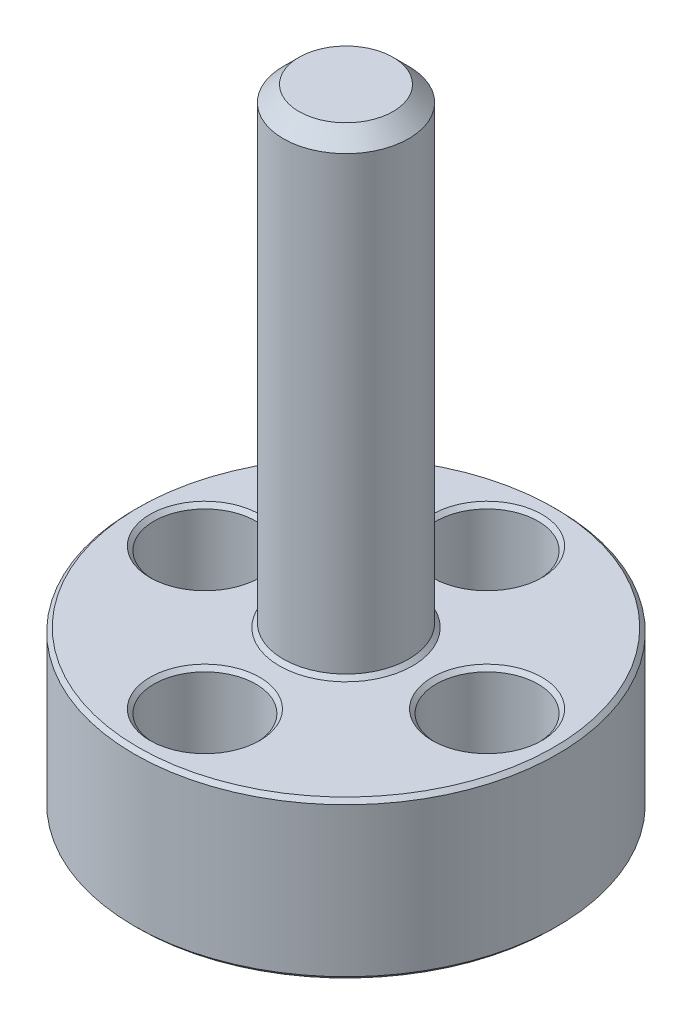
ISO-10303-21;
HEADER;
FILE_DESCRIPTION(('STEP AP214'),'2;1');
FILE_NAME('part.step','',(''),(''),'','','');
FILE_SCHEMA(('AUTOMOTIVE_DESIGN { 1 0 10303 214 1 1 1 1 }'));
ENDSEC;
DATA;
#1=APPLICATION_CONTEXT('core data for automotive mechanical design processes');
#2=APPLICATION_PROTOCOL_DEFINITION('international standard','automotive_design',2000,#1);
#3=PRODUCT_CONTEXT('',#1,'mechanical');
#4=PRODUCT('Part','Part','',(#3));
#5=PRODUCT_RELATED_PRODUCT_CATEGORY('part','',(#4));
#6=PRODUCT_DEFINITION_FORMATION('','',#4);
#7=PRODUCT_DEFINITION_CONTEXT('part definition',#1,'design');
#8=PRODUCT_DEFINITION('design','',#6,#7);
#9=PRODUCT_DEFINITION_SHAPE('','',#8);
#10=(LENGTH_UNIT() NAMED_UNIT(*) SI_UNIT(.MILLI.,.METRE.));
#11=(NAMED_UNIT(*) PLANE_ANGLE_UNIT() SI_UNIT($,.RADIAN.));
#12=(NAMED_UNIT(*) SI_UNIT($,.STERADIAN.) SOLID_ANGLE_UNIT());
#13=UNCERTAINTY_MEASURE_WITH_UNIT(LENGTH_MEASURE(1.E-05),#10,'distance_accuracy_value','');
#14=(GEOMETRIC_REPRESENTATION_CONTEXT(3) GLOBAL_UNCERTAINTY_ASSIGNED_CONTEXT((#13)) GLOBAL_UNIT_ASSIGNED_CONTEXT((#10,
#11,#12)) REPRESENTATION_CONTEXT('',''));
#15=CARTESIAN_POINT('',(0.,0.,0.));
#16=DIRECTION('',(0.,0.,1.));
#17=DIRECTION('',(1.,0.,0.));
#18=AXIS2_PLACEMENT_3D('',#15,#16,#17);
#19=CARTESIAN_POINT('',(0.,10.,0.));
#20=DIRECTION('',(0.,-1.,0.));
#21=DIRECTION('',(0.,0.,-1.));
#22=AXIS2_PLACEMENT_3D('',#19,#20,#21);
#23=CYLINDRICAL_SURFACE('',#22,13.5);
#24=CARTESIAN_POINT('',(0.,0.250000000000002,0.));
#25=DIRECTION('',(0.,1.,0.));
#26=DIRECTION('',(0.,0.,1.));
#27=AXIS2_PLACEMENT_3D('',#24,#25,#26);
#28=CIRCLE('',#27,13.5);
#29=CARTESIAN_POINT('',(0.,0.250000000000002,13.5));
#30=VERTEX_POINT('',#29);
#31=EDGE_CURVE('E160',#30,#30,#28,.T.);
#32=ORIENTED_EDGE('',*,*,#31,.T.);
#33=EDGE_LOOP('',(#32));
#34=FACE_BOUND('',#33,.T.);
#35=CARTESIAN_POINT('',(0.,9.75,0.));
#36=DIRECTION('',(0.,1.,0.));
#37=DIRECTION('',(0.,0.,1.));
#38=AXIS2_PLACEMENT_3D('',#35,#36,#37);
#39=CIRCLE('',#38,13.5);
#40=CARTESIAN_POINT('',(0.,9.75,13.5));
#41=VERTEX_POINT('',#40);
#42=EDGE_CURVE('E164',#41,#41,#39,.F.);
#43=ORIENTED_EDGE('',*,*,#42,.T.);
#44=EDGE_LOOP('',(#43));
#45=FACE_BOUND('',#44,.T.);
#46=ADVANCED_FACE('F55',(#34,#45),#23,.T.);
#47=CARTESIAN_POINT('',(0.,10.,0.));
#48=DIRECTION('',(0.,1.,0.));
#49=DIRECTION('',(0.,0.,1.));
#50=AXIS2_PLACEMENT_3D('',#47,#48,#49);
#51=PLANE('',#50);
#52=CARTESIAN_POINT('',(0.,10.,0.));
#53=DIRECTION('',(0.,1.,0.));
#54=DIRECTION('',(0.,0.,1.));
#55=AXIS2_PLACEMENT_3D('',#52,#53,#54);
#56=CIRCLE('',#55,13.25);
#57=CARTESIAN_POINT('',(0.,10.,13.25));
#58=VERTEX_POINT('',#57);
#59=EDGE_CURVE('E92',#58,#58,#56,.T.);
#60=ORIENTED_EDGE('',*,*,#59,.T.);
#61=EDGE_LOOP('',(#60));
#62=FACE_BOUND('',#61,.T.);
#63=CARTESIAN_POINT('',(0.,10.,0.));
#64=DIRECTION('',(0.,1.,0.));
#65=DIRECTION('',(0.,0.,1.));
#66=AXIS2_PLACEMENT_3D('',#63,#64,#65);
#67=CIRCLE('',#66,4.24999999999999);
#68=CARTESIAN_POINT('',(0.,10.,4.24999999999999));
#69=VERTEX_POINT('',#68);
#70=EDGE_CURVE('E96',#69,#69,#67,.F.);
#71=ORIENTED_EDGE('',*,*,#70,.T.);
#72=EDGE_LOOP('',(#71));
#73=FACE_BOUND('',#72,.T.);
#74=CARTESIAN_POINT('',(0.,10.,9.));
#75=DIRECTION('',(0.,1.,0.));
#76=DIRECTION('',(0.,0.,1.));
#77=AXIS2_PLACEMENT_3D('',#74,#75,#76);
#78=CIRCLE('',#77,3.5);
#79=CARTESIAN_POINT('',(0.,10.,12.5));
#80=VERTEX_POINT('',#79);
#81=EDGE_CURVE('E100',#80,#80,#78,.F.);
#82=ORIENTED_EDGE('',*,*,#81,.T.);
#83=EDGE_LOOP('',(#82));
#84=FACE_BOUND('',#83,.T.);
#85=CARTESIAN_POINT('',(9.,10.,0.));
#86=DIRECTION('',(0.,1.,0.));
#87=DIRECTION('',(0.,0.,1.));
#88=AXIS2_PLACEMENT_3D('',#85,#86,#87);
#89=CIRCLE('',#88,3.5);
#90=CARTESIAN_POINT('',(9.,10.,3.5));
#91=VERTEX_POINT('',#90);
#92=EDGE_CURVE('E104',#91,#91,#89,.F.);
#93=ORIENTED_EDGE('',*,*,#92,.T.);
#94=EDGE_LOOP('',(#93));
#95=FACE_BOUND('',#94,.T.);
#96=CARTESIAN_POINT('',(0.,10.,-9.));
#97=DIRECTION('',(0.,1.,0.));
#98=DIRECTION('',(0.,0.,1.));
#99=AXIS2_PLACEMENT_3D('',#96,#97,#98);
#100=CIRCLE('',#99,3.5);
#101=CARTESIAN_POINT('',(0.,10.,-5.5));
#102=VERTEX_POINT('',#101);
#103=EDGE_CURVE('E108',#102,#102,#100,.F.);
#104=ORIENTED_EDGE('',*,*,#103,.T.);
#105=EDGE_LOOP('',(#104));
#106=FACE_BOUND('',#105,.T.);
#107=CARTESIAN_POINT('',(-9.,10.,0.));
#108=DIRECTION('',(0.,1.,0.));
#109=DIRECTION('',(0.,0.,1.));
#110=AXIS2_PLACEMENT_3D('',#107,#108,#109);
#111=CIRCLE('',#110,3.5);
#112=CARTESIAN_POINT('',(-9.,10.,3.5));
#113=VERTEX_POINT('',#112);
#114=EDGE_CURVE('E112',#113,#113,#111,.F.);
#115=ORIENTED_EDGE('',*,*,#114,.T.);
#116=EDGE_LOOP('',(#115));
#117=FACE_BOUND('',#116,.T.);
#118=ADVANCED_FACE('F223',(#62,#73,#84,#95,#106,#117),#51,.T.);
#119=CARTESIAN_POINT('',(0.,0.,0.));
#120=DIRECTION('',(0.,1.,0.));
#121=DIRECTION('',(0.,0.,1.));
#122=AXIS2_PLACEMENT_3D('',#119,#120,#121);
#123=PLANE('',#122);
#124=CARTESIAN_POINT('',(0.,0.,0.));
#125=DIRECTION('',(0.,1.,0.));
#126=DIRECTION('',(0.,0.,1.));
#127=AXIS2_PLACEMENT_3D('',#124,#125,#126);
#128=CIRCLE('',#127,13.25);
#129=CARTESIAN_POINT('',(0.,0.,13.25));
#130=VERTEX_POINT('',#129);
#131=EDGE_CURVE('E136',#130,#130,#128,.F.);
#132=ORIENTED_EDGE('',*,*,#131,.T.);
#133=EDGE_LOOP('',(#132));
#134=FACE_BOUND('',#133,.T.);
#135=CARTESIAN_POINT('',(0.,0.,9.));
#136=DIRECTION('',(0.,1.,0.));
#137=DIRECTION('',(0.,0.,1.));
#138=AXIS2_PLACEMENT_3D('',#135,#136,#137);
#139=CIRCLE('',#138,1.85);
#140=CARTESIAN_POINT('',(0.,0.,10.85));
#141=VERTEX_POINT('',#140);
#142=EDGE_CURVE('E140',#141,#141,#139,.T.);
#143=ORIENTED_EDGE('',*,*,#142,.T.);
#144=EDGE_LOOP('',(#143));
#145=FACE_BOUND('',#144,.T.);
#146=CARTESIAN_POINT('',(9.,0.,0.));
#147=DIRECTION('',(0.,1.,0.));
#148=DIRECTION('',(0.,0.,1.));
#149=AXIS2_PLACEMENT_3D('',#146,#147,#148);
#150=CIRCLE('',#149,1.84999999999998);
#151=CARTESIAN_POINT('',(9.,0.,1.84999999999998));
#152=VERTEX_POINT('',#151);
#153=EDGE_CURVE('E144',#152,#152,#150,.T.);
#154=ORIENTED_EDGE('',*,*,#153,.T.);
#155=EDGE_LOOP('',(#154));
#156=FACE_BOUND('',#155,.T.);
#157=CARTESIAN_POINT('',(0.,0.,-9.));
#158=DIRECTION('',(0.,1.,0.));
#159=DIRECTION('',(0.,0.,1.));
#160=AXIS2_PLACEMENT_3D('',#157,#158,#159);
#161=CIRCLE('',#160,1.84999999999999);
#162=CARTESIAN_POINT('',(0.,0.,-7.15000000000001));
#163=VERTEX_POINT('',#162);
#164=EDGE_CURVE('E148',#163,#163,#161,.T.);
#165=ORIENTED_EDGE('',*,*,#164,.T.);
#166=EDGE_LOOP('',(#165));
#167=FACE_BOUND('',#166,.T.);
#168=CARTESIAN_POINT('',(-9.,0.,0.));
#169=DIRECTION('',(0.,1.,0.));
#170=DIRECTION('',(0.,0.,1.));
#171=AXIS2_PLACEMENT_3D('',#168,#169,#170);
#172=CIRCLE('',#171,1.84999999999998);
#173=CARTESIAN_POINT('',(-9.,0.,1.84999999999998));
#174=VERTEX_POINT('',#173);
#175=EDGE_CURVE('E152',#174,#174,#172,.T.);
#176=ORIENTED_EDGE('',*,*,#175,.T.);
#177=EDGE_LOOP('',(#176));
#178=FACE_BOUND('',#177,.T.);
#179=CARTESIAN_POINT('',(0.,0.,0.));
#180=DIRECTION('',(0.,1.,0.));
#181=DIRECTION('',(0.,0.,1.));
#182=AXIS2_PLACEMENT_3D('',#179,#180,#181);
#183=CIRCLE('',#182,2.5);
#184=CARTESIAN_POINT('',(0.,0.,2.5));
#185=VERTEX_POINT('',#184);
#186=EDGE_CURVE('E156',#185,#185,#183,.T.);
#187=ORIENTED_EDGE('',*,*,#186,.T.);
#188=EDGE_LOOP('',(#187));
#189=FACE_BOUND('',#188,.T.);
#190=ADVANCED_FACE('F229',(#134,#145,#156,#167,#178,#189),#123,.F.);
#191=CARTESIAN_POINT('',(0.,40.,0.));
#192=DIRECTION('',(0.,-1.,0.));
#193=DIRECTION('',(0.,0.,-1.));
#194=AXIS2_PLACEMENT_3D('',#191,#192,#193);
#195=CYLINDRICAL_SURFACE('',#194,4.);
#196=CARTESIAN_POINT('',(0.,39.,0.));
#197=DIRECTION('',(0.,1.,0.));
#198=DIRECTION('',(0.,0.,1.));
#199=AXIS2_PLACEMENT_3D('',#196,#197,#198);
#200=CIRCLE('',#199,4.);
#201=CARTESIAN_POINT('',(0.,39.,4.));
#202=VERTEX_POINT('',#201);
#203=EDGE_CURVE('E10',#202,#202,#200,.F.);
#204=ORIENTED_EDGE('',*,*,#203,.T.);
#205=EDGE_LOOP('',(#204));
#206=FACE_BOUND('',#205,.T.);
#207=CARTESIAN_POINT('',(0.,10.25,0.));
#208=DIRECTION('',(0.,1.,0.));
#209=DIRECTION('',(0.,0.,1.));
#210=AXIS2_PLACEMENT_3D('',#207,#208,#209);
#211=CIRCLE('',#210,4.);
#212=CARTESIAN_POINT('',(0.,10.25,4.));
#213=VERTEX_POINT('',#212);
#214=EDGE_CURVE('E88',#213,#213,#211,.T.);
#215=ORIENTED_EDGE('',*,*,#214,.T.);
#216=EDGE_LOOP('',(#215));
#217=FACE_BOUND('',#216,.T.);
#218=ADVANCED_FACE('F376',(#206,#217),#195,.T.);
#219=CARTESIAN_POINT('',(0.,40.,0.));
#220=DIRECTION('',(0.,1.,0.));
#221=DIRECTION('',(0.,0.,1.));
#222=AXIS2_PLACEMENT_3D('',#219,#220,#221);
#223=PLANE('',#222);
#224=CARTESIAN_POINT('',(0.,40.,0.));
#225=DIRECTION('',(0.,1.,0.));
#226=DIRECTION('',(0.,0.,1.));
#227=AXIS2_PLACEMENT_3D('',#224,#225,#226);
#228=CIRCLE('',#227,3.00000000000001);
#229=CARTESIAN_POINT('',(0.,40.,3.00000000000001));
#230=VERTEX_POINT('',#229);
#231=EDGE_CURVE('E64',#230,#230,#228,.T.);
#232=ORIENTED_EDGE('',*,*,#231,.T.);
#233=EDGE_LOOP('',(#232));
#234=FACE_BOUND('',#233,.T.);
#235=ADVANCED_FACE('F372',(#234),#223,.T.);
#236=CARTESIAN_POINT('',(0.,10.,9.));
#237=DIRECTION('',(0.,1.,0.));
#238=DIRECTION('',(0.,0.,1.));
#239=AXIS2_PLACEMENT_3D('',#236,#237,#238);
#240=CYLINDRICAL_SURFACE('',#239,1.6);
#241=CARTESIAN_POINT('',(0.,0.250000000000007,9.));
#242=DIRECTION('',(0.,1.,0.));
#243=DIRECTION('',(0.,0.,1.));
#244=AXIS2_PLACEMENT_3D('',#241,#242,#243);
#245=CIRCLE('',#244,1.6);
#246=CARTESIAN_POINT('',(0.,0.250000000000007,10.6));
#247=VERTEX_POINT('',#246);
#248=EDGE_CURVE('E132',#247,#247,#245,.F.);
#249=ORIENTED_EDGE('',*,*,#248,.T.);
#250=EDGE_LOOP('',(#249));
#251=FACE_BOUND('',#250,.T.);
#252=CARTESIAN_POINT('',(0.,5.,9.));
#253=DIRECTION('',(0.,1.,0.));
#254=DIRECTION('',(0.,0.,1.));
#255=AXIS2_PLACEMENT_3D('',#252,#253,#254);
#256=CIRCLE('',#255,1.6);
#257=CARTESIAN_POINT('',(0.,5.,10.6));
#258=VERTEX_POINT('',#257);
#259=EDGE_CURVE('E168',#258,#258,#256,.T.);
#260=ORIENTED_EDGE('',*,*,#259,.T.);
#261=EDGE_LOOP('',(#260));
#262=FACE_BOUND('',#261,.T.);
#263=ADVANCED_FACE('F368',(#251,#262),#240,.F.);
#264=CARTESIAN_POINT('',(1.6,5.,9.));
#265=DIRECTION('',(0.,-1.,0.));
#266=DIRECTION('',(0.,0.,-1.));
#267=AXIS2_PLACEMENT_3D('',#264,#265,#266);
#268=PLANE('',#267);
#269=ORIENTED_EDGE('',*,*,#259,.F.);
#270=EDGE_LOOP('',(#269));
#271=FACE_BOUND('',#270,.T.);
#272=CARTESIAN_POINT('',(0.,5.,9.));
#273=DIRECTION('',(0.,1.,0.));
#274=DIRECTION('',(0.,0.,1.));
#275=AXIS2_PLACEMENT_3D('',#272,#273,#274);
#276=CIRCLE('',#275,3.25);
#277=CARTESIAN_POINT('',(0.,5.,12.25));
#278=VERTEX_POINT('',#277);
#279=EDGE_CURVE('E172',#278,#278,#276,.T.);
#280=ORIENTED_EDGE('',*,*,#279,.T.);
#281=EDGE_LOOP('',(#280));
#282=FACE_BOUND('',#281,.T.);
#283=ADVANCED_FACE('F364',(#271,#282),#268,.F.);
#284=CARTESIAN_POINT('',(0.,10.,9.));
#285=DIRECTION('',(0.,1.,0.));
#286=DIRECTION('',(0.,0.,1.));
#287=AXIS2_PLACEMENT_3D('',#284,#285,#286);
#288=CYLINDRICAL_SURFACE('',#287,3.25);
#289=CARTESIAN_POINT('',(0.,9.75000000000001,9.));
#290=DIRECTION('',(0.,1.,0.));
#291=DIRECTION('',(0.,0.,1.));
#292=AXIS2_PLACEMENT_3D('',#289,#290,#291);
#293=CIRCLE('',#292,3.25);
#294=CARTESIAN_POINT('',(0.,9.75000000000001,12.25));
#295=VERTEX_POINT('',#294);
#296=EDGE_CURVE('E84',#295,#295,#293,.T.);
#297=ORIENTED_EDGE('',*,*,#296,.T.);
#298=EDGE_LOOP('',(#297));
#299=FACE_BOUND('',#298,.T.);
#300=ORIENTED_EDGE('',*,*,#279,.F.);
#301=EDGE_LOOP('',(#300));
#302=FACE_BOUND('',#301,.T.);
#303=ADVANCED_FACE('F360',(#299,#302),#288,.F.);
#304=CARTESIAN_POINT('',(9.,10.,0.));
#305=DIRECTION('',(0.,1.,0.));
#306=DIRECTION('',(0.,0.,1.));
#307=AXIS2_PLACEMENT_3D('',#304,#305,#306);
#308=CYLINDRICAL_SURFACE('',#307,1.6);
#309=CARTESIAN_POINT('',(9.,0.249999999999993,0.));
#310=DIRECTION('',(0.,1.,0.));
#311=DIRECTION('',(0.,0.,1.));
#312=AXIS2_PLACEMENT_3D('',#309,#310,#311);
#313=CIRCLE('',#312,1.6);
#314=CARTESIAN_POINT('',(9.,0.249999999999993,1.6));
#315=VERTEX_POINT('',#314);
#316=EDGE_CURVE('E128',#315,#315,#313,.F.);
#317=ORIENTED_EDGE('',*,*,#316,.T.);
#318=EDGE_LOOP('',(#317));
#319=FACE_BOUND('',#318,.T.);
#320=CARTESIAN_POINT('',(9.,5.,0.));
#321=DIRECTION('',(0.,1.,0.));
#322=DIRECTION('',(0.,0.,1.));
#323=AXIS2_PLACEMENT_3D('',#320,#321,#322);
#324=CIRCLE('',#323,1.6);
#325=CARTESIAN_POINT('',(9.,5.,1.6));
#326=VERTEX_POINT('',#325);
#327=EDGE_CURVE('E176',#326,#326,#324,.T.);
#328=ORIENTED_EDGE('',*,*,#327,.T.);
#329=EDGE_LOOP('',(#328));
#330=FACE_BOUND('',#329,.T.);
#331=ADVANCED_FACE('F356',(#319,#330),#308,.F.);
#332=CARTESIAN_POINT('',(10.6,5.,0.));
#333=DIRECTION('',(0.,-1.,0.));
#334=DIRECTION('',(0.,0.,-1.));
#335=AXIS2_PLACEMENT_3D('',#332,#333,#334);
#336=PLANE('',#335);
#337=ORIENTED_EDGE('',*,*,#327,.F.);
#338=EDGE_LOOP('',(#337));
#339=FACE_BOUND('',#338,.T.);
#340=CARTESIAN_POINT('',(9.,5.,0.));
#341=DIRECTION('',(0.,1.,0.));
#342=DIRECTION('',(0.,0.,1.));
#343=AXIS2_PLACEMENT_3D('',#340,#341,#342);
#344=CIRCLE('',#343,3.25);
#345=CARTESIAN_POINT('',(9.,5.,3.25));
#346=VERTEX_POINT('',#345);
#347=EDGE_CURVE('E180',#346,#346,#344,.T.);
#348=ORIENTED_EDGE('',*,*,#347,.T.);
#349=EDGE_LOOP('',(#348));
#350=FACE_BOUND('',#349,.T.);
#351=ADVANCED_FACE('F352',(#339,#350),#336,.F.);
#352=CARTESIAN_POINT('',(9.,10.,0.));
#353=DIRECTION('',(0.,1.,0.));
#354=DIRECTION('',(0.,0.,1.));
#355=AXIS2_PLACEMENT_3D('',#352,#353,#354);
#356=CYLINDRICAL_SURFACE('',#355,3.25);
#357=CARTESIAN_POINT('',(9.,9.75000000000001,0.));
#358=DIRECTION('',(0.,1.,0.));
#359=DIRECTION('',(0.,0.,1.));
#360=AXIS2_PLACEMENT_3D('',#357,#358,#359);
#361=CIRCLE('',#360,3.25);
#362=CARTESIAN_POINT('',(9.,9.75000000000001,3.25));
#363=VERTEX_POINT('',#362);
#364=EDGE_CURVE('E80',#363,#363,#361,.T.);
#365=ORIENTED_EDGE('',*,*,#364,.T.);
#366=EDGE_LOOP('',(#365));
#367=FACE_BOUND('',#366,.T.);
#368=ORIENTED_EDGE('',*,*,#347,.F.);
#369=EDGE_LOOP('',(#368));
#370=FACE_BOUND('',#369,.T.);
#371=ADVANCED_FACE('F348',(#367,#370),#356,.F.);
#372=CARTESIAN_POINT('',(0.,10.,-9.));
#373=DIRECTION('',(0.,1.,0.));
#374=DIRECTION('',(0.,0.,1.));
#375=AXIS2_PLACEMENT_3D('',#372,#373,#374);
#376=CYLINDRICAL_SURFACE('',#375,1.6);
#377=CARTESIAN_POINT('',(0.,0.249999999999997,-9.));
#378=DIRECTION('',(0.,1.,0.));
#379=DIRECTION('',(0.,0.,1.));
#380=AXIS2_PLACEMENT_3D('',#377,#378,#379);
#381=CIRCLE('',#380,1.6);
#382=CARTESIAN_POINT('',(0.,0.249999999999997,-7.4));
#383=VERTEX_POINT('',#382);
#384=EDGE_CURVE('E124',#383,#383,#381,.F.);
#385=ORIENTED_EDGE('',*,*,#384,.T.);
#386=EDGE_LOOP('',(#385));
#387=FACE_BOUND('',#386,.T.);
#388=CARTESIAN_POINT('',(0.,5.,-9.));
#389=DIRECTION('',(0.,1.,0.));
#390=DIRECTION('',(0.,0.,1.));
#391=AXIS2_PLACEMENT_3D('',#388,#389,#390);
#392=CIRCLE('',#391,1.6);
#393=CARTESIAN_POINT('',(0.,5.,-7.4));
#394=VERTEX_POINT('',#393);
#395=EDGE_CURVE('E184',#394,#394,#392,.T.);
#396=ORIENTED_EDGE('',*,*,#395,.T.);
#397=EDGE_LOOP('',(#396));
#398=FACE_BOUND('',#397,.T.);
#399=ADVANCED_FACE('F344',(#387,#398),#376,.F.);
#400=CARTESIAN_POINT('',(1.6,5.,-9.));
#401=DIRECTION('',(0.,-1.,0.));
#402=DIRECTION('',(0.,0.,-1.));
#403=AXIS2_PLACEMENT_3D('',#400,#401,#402);
#404=PLANE('',#403);
#405=ORIENTED_EDGE('',*,*,#395,.F.);
#406=EDGE_LOOP('',(#405));
#407=FACE_BOUND('',#406,.T.);
#408=CARTESIAN_POINT('',(0.,5.,-9.));
#409=DIRECTION('',(0.,1.,0.));
#410=DIRECTION('',(0.,0.,1.));
#411=AXIS2_PLACEMENT_3D('',#408,#409,#410);
#412=CIRCLE('',#411,3.25);
#413=CARTESIAN_POINT('',(0.,5.,-5.75));
#414=VERTEX_POINT('',#413);
#415=EDGE_CURVE('E188',#414,#414,#412,.T.);
#416=ORIENTED_EDGE('',*,*,#415,.T.);
#417=EDGE_LOOP('',(#416));
#418=FACE_BOUND('',#417,.T.);
#419=ADVANCED_FACE('F341',(#407,#418),#404,.F.);
#420=CARTESIAN_POINT('',(0.,10.,-9.));
#421=DIRECTION('',(0.,1.,0.));
#422=DIRECTION('',(0.,0.,1.));
#423=AXIS2_PLACEMENT_3D('',#420,#421,#422);
#424=CYLINDRICAL_SURFACE('',#423,3.25);
#425=CARTESIAN_POINT('',(0.,9.75000000000001,-9.));
#426=DIRECTION('',(0.,1.,0.));
#427=DIRECTION('',(0.,0.,1.));
#428=AXIS2_PLACEMENT_3D('',#425,#426,#427);
#429=CIRCLE('',#428,3.25);
#430=CARTESIAN_POINT('',(0.,9.75000000000001,-5.75));
#431=VERTEX_POINT('',#430);
#432=EDGE_CURVE('E74',#431,#431,#429,.T.);
#433=ORIENTED_EDGE('',*,*,#432,.T.);
#434=EDGE_LOOP('',(#433));
#435=FACE_BOUND('',#434,.T.);
#436=ORIENTED_EDGE('',*,*,#415,.F.);
#437=EDGE_LOOP('',(#436));
#438=FACE_BOUND('',#437,.T.);
#439=ADVANCED_FACE('F334',(#435,#438),#424,.F.);
#440=CARTESIAN_POINT('',(-9.,10.,0.));
#441=DIRECTION('',(0.,1.,0.));
#442=DIRECTION('',(0.,0.,1.));
#443=AXIS2_PLACEMENT_3D('',#440,#441,#442);
#444=CYLINDRICAL_SURFACE('',#443,1.6);
#445=CARTESIAN_POINT('',(-9.,0.249999999999993,0.));
#446=DIRECTION('',(0.,1.,0.));
#447=DIRECTION('',(0.,0.,1.));
#448=AXIS2_PLACEMENT_3D('',#445,#446,#447);
#449=CIRCLE('',#448,1.6);
#450=CARTESIAN_POINT('',(-9.,0.249999999999993,1.6));
#451=VERTEX_POINT('',#450);
#452=EDGE_CURVE('E120',#451,#451,#449,.F.);
#453=ORIENTED_EDGE('',*,*,#452,.T.);
#454=EDGE_LOOP('',(#453));
#455=FACE_BOUND('',#454,.T.);
#456=CARTESIAN_POINT('',(-9.,5.,0.));
#457=DIRECTION('',(0.,1.,0.));
#458=DIRECTION('',(0.,0.,1.));
#459=AXIS2_PLACEMENT_3D('',#456,#457,#458);
#460=CIRCLE('',#459,1.6);
#461=CARTESIAN_POINT('',(-9.,5.,1.6));
#462=VERTEX_POINT('',#461);
#463=EDGE_CURVE('E192',#462,#462,#460,.T.);
#464=ORIENTED_EDGE('',*,*,#463,.T.);
#465=EDGE_LOOP('',(#464));
#466=FACE_BOUND('',#465,.T.);
#467=ADVANCED_FACE('F327',(#455,#466),#444,.F.);
#468=CARTESIAN_POINT('',(-7.4,5.,0.));
#469=DIRECTION('',(0.,-1.,0.));
#470=DIRECTION('',(0.,0.,-1.));
#471=AXIS2_PLACEMENT_3D('',#468,#469,#470);
#472=PLANE('',#471);
#473=ORIENTED_EDGE('',*,*,#463,.F.);
#474=EDGE_LOOP('',(#473));
#475=FACE_BOUND('',#474,.T.);
#476=CARTESIAN_POINT('',(-9.,5.,0.));
#477=DIRECTION('',(0.,1.,0.));
#478=DIRECTION('',(0.,0.,1.));
#479=AXIS2_PLACEMENT_3D('',#476,#477,#478);
#480=CIRCLE('',#479,3.25);
#481=CARTESIAN_POINT('',(-9.,5.,3.25));
#482=VERTEX_POINT('',#481);
#483=EDGE_CURVE('E196',#482,#482,#480,.T.);
#484=ORIENTED_EDGE('',*,*,#483,.T.);
#485=EDGE_LOOP('',(#484));
#486=FACE_BOUND('',#485,.T.);
#487=ADVANCED_FACE('F323',(#475,#486),#472,.F.);
#488=CARTESIAN_POINT('',(-9.,10.,0.));
#489=DIRECTION('',(0.,1.,0.));
#490=DIRECTION('',(0.,0.,1.));
#491=AXIS2_PLACEMENT_3D('',#488,#489,#490);
#492=CYLINDRICAL_SURFACE('',#491,3.25);
#493=CARTESIAN_POINT('',(-9.,9.75000000000001,0.));
#494=DIRECTION('',(0.,1.,0.));
#495=DIRECTION('',(0.,0.,1.));
#496=AXIS2_PLACEMENT_3D('',#493,#494,#495);
#497=CIRCLE('',#496,3.25);
#498=CARTESIAN_POINT('',(-9.,9.75000000000001,3.25));
#499=VERTEX_POINT('',#498);
#500=EDGE_CURVE('E69',#499,#499,#497,.T.);
#501=ORIENTED_EDGE('',*,*,#500,.T.);
#502=EDGE_LOOP('',(#501));
#503=FACE_BOUND('',#502,.T.);
#504=ORIENTED_EDGE('',*,*,#483,.F.);
#505=EDGE_LOOP('',(#504));
#506=FACE_BOUND('',#505,.T.);
#507=ADVANCED_FACE('F220',(#503,#506),#492,.F.);
#508=CARTESIAN_POINT('',(0.,7.,0.));
#509=DIRECTION('',(0.,-1.,0.));
#510=DIRECTION('',(0.,0.,-1.));
#511=AXIS2_PLACEMENT_3D('',#508,#509,#510);
#512=CYLINDRICAL_SURFACE('',#511,2.25);
#513=CARTESIAN_POINT('',(0.,0.250000000000001,0.));
#514=DIRECTION('',(0.,1.,0.));
#515=DIRECTION('',(0.,0.,1.));
#516=AXIS2_PLACEMENT_3D('',#513,#514,#515);
#517=CIRCLE('',#516,2.25);
#518=CARTESIAN_POINT('',(0.,0.250000000000001,2.25));
#519=VERTEX_POINT('',#518);
#520=EDGE_CURVE('E116',#519,#519,#517,.F.);
#521=ORIENTED_EDGE('',*,*,#520,.T.);
#522=EDGE_LOOP('',(#521));
#523=FACE_BOUND('',#522,.T.);
#524=CARTESIAN_POINT('',(0.,7.,0.));
#525=DIRECTION('',(0.,1.,0.));
#526=DIRECTION('',(0.,0.,1.));
#527=AXIS2_PLACEMENT_3D('',#524,#525,#526);
#528=CIRCLE('',#527,2.25);
#529=CARTESIAN_POINT('',(0.,7.,2.25));
#530=VERTEX_POINT('',#529);
#531=EDGE_CURVE('E200',#530,#530,#528,.T.);
#532=ORIENTED_EDGE('',*,*,#531,.T.);
#533=EDGE_LOOP('',(#532));
#534=FACE_BOUND('',#533,.T.);
#535=ADVANCED_FACE('F205',(#523,#534),#512,.F.);
#536=CARTESIAN_POINT('',(0.,7.,0.));
#537=DIRECTION('',(0.,1.,0.));
#538=DIRECTION('',(0.,0.,1.));
#539=AXIS2_PLACEMENT_3D('',#536,#537,#538);
#540=PLANE('',#539);
#541=ORIENTED_EDGE('',*,*,#531,.F.);
#542=EDGE_LOOP('',(#541));
#543=FACE_BOUND('',#542,.T.);
#544=ADVANCED_FACE('F207',(#543),#540,.F.);
#545=CARTESIAN_POINT('',(0.,0.250000000000002,0.));
#546=DIRECTION('',(0.,1.,0.));
#547=DIRECTION('',(0.,0.,1.));
#548=AXIS2_PLACEMENT_3D('',#545,#546,#547);
#549=CONICAL_SURFACE('',#548,13.5,0.785398163397438);
#550=ORIENTED_EDGE('',*,*,#131,.F.);
#551=EDGE_LOOP('',(#550));
#552=FACE_BOUND('',#551,.T.);
#553=ORIENTED_EDGE('',*,*,#31,.F.);
#554=EDGE_LOOP('',(#553));
#555=FACE_BOUND('',#554,.T.);
#556=ADVANCED_FACE('F209',(#552,#555),#549,.T.);
#557=CARTESIAN_POINT('',(0.,0.,9.));
#558=DIRECTION('',(0.,-1.,0.));
#559=DIRECTION('',(0.,0.,-1.));
#560=AXIS2_PLACEMENT_3D('',#557,#558,#559);
#561=CONICAL_SURFACE('',#560,1.85,0.785398163397446);
#562=ORIENTED_EDGE('',*,*,#248,.F.);
#563=EDGE_LOOP('',(#562));
#564=FACE_BOUND('',#563,.T.);
#565=ORIENTED_EDGE('',*,*,#142,.F.);
#566=EDGE_LOOP('',(#565));
#567=FACE_BOUND('',#566,.T.);
#568=ADVANCED_FACE('F216',(#564,#567),#561,.F.);
#569=CARTESIAN_POINT('',(9.,0.,0.));
#570=DIRECTION('',(0.,-1.,0.));
#571=DIRECTION('',(0.,0.,-1.));
#572=AXIS2_PLACEMENT_3D('',#569,#570,#571);
#573=CONICAL_SURFACE('',#572,1.84999999999998,0.785398163397433);
#574=ORIENTED_EDGE('',*,*,#316,.F.);
#575=EDGE_LOOP('',(#574));
#576=FACE_BOUND('',#575,.T.);
#577=ORIENTED_EDGE('',*,*,#153,.F.);
#578=EDGE_LOOP('',(#577));
#579=FACE_BOUND('',#578,.T.);
#580=ADVANCED_FACE('F244',(#576,#579),#573,.F.);
#581=CARTESIAN_POINT('',(0.,0.,-9.));
#582=DIRECTION('',(0.,-1.,0.));
#583=DIRECTION('',(0.,0.,-1.));
#584=AXIS2_PLACEMENT_3D('',#581,#582,#583);
#585=CONICAL_SURFACE('',#584,1.84999999999999,0.785398163397439);
#586=ORIENTED_EDGE('',*,*,#384,.F.);
#587=EDGE_LOOP('',(#586));
#588=FACE_BOUND('',#587,.T.);
#589=ORIENTED_EDGE('',*,*,#164,.F.);
#590=EDGE_LOOP('',(#589));
#591=FACE_BOUND('',#590,.T.);
#592=ADVANCED_FACE('F251',(#588,#591),#585,.F.);
#593=CARTESIAN_POINT('',(-9.,0.,0.));
#594=DIRECTION('',(0.,-1.,0.));
#595=DIRECTION('',(0.,0.,-1.));
#596=AXIS2_PLACEMENT_3D('',#593,#594,#595);
#597=CONICAL_SURFACE('',#596,1.84999999999998,0.785398163397432);
#598=ORIENTED_EDGE('',*,*,#452,.F.);
#599=EDGE_LOOP('',(#598));
#600=FACE_BOUND('',#599,.T.);
#601=ORIENTED_EDGE('',*,*,#175,.F.);
#602=EDGE_LOOP('',(#601));
#603=FACE_BOUND('',#602,.T.);
#604=ADVANCED_FACE('F258',(#600,#603),#597,.F.);
#605=CARTESIAN_POINT('',(0.,0.,0.));
#606=DIRECTION('',(0.,-1.,0.));
#607=DIRECTION('',(0.,0.,-1.));
#608=AXIS2_PLACEMENT_3D('',#605,#606,#607);
#609=CONICAL_SURFACE('',#608,2.5,0.785398163397451);
#610=ORIENTED_EDGE('',*,*,#520,.F.);
#611=EDGE_LOOP('',(#610));
#612=FACE_BOUND('',#611,.T.);
#613=ORIENTED_EDGE('',*,*,#186,.F.);
#614=EDGE_LOOP('',(#613));
#615=FACE_BOUND('',#614,.T.);
#616=ADVANCED_FACE('F265',(#612,#615),#609,.F.);
#617=CARTESIAN_POINT('',(0.,10.,0.));
#618=DIRECTION('',(0.,-1.,0.));
#619=DIRECTION('',(0.,0.,-1.));
#620=AXIS2_PLACEMENT_3D('',#617,#618,#619);
#621=CONICAL_SURFACE('',#620,13.25,0.785398163397434);
#622=ORIENTED_EDGE('',*,*,#42,.F.);
#623=EDGE_LOOP('',(#622));
#624=FACE_BOUND('',#623,.T.);
#625=ORIENTED_EDGE('',*,*,#59,.F.);
#626=EDGE_LOOP('',(#625));
#627=FACE_BOUND('',#626,.T.);
#628=ADVANCED_FACE('F272',(#624,#627),#621,.T.);
#629=CARTESIAN_POINT('',(0.,10.,0.));
#630=DIRECTION('',(0.,-1.,0.));
#631=DIRECTION('',(0.,0.,-1.));
#632=AXIS2_PLACEMENT_3D('',#629,#630,#631);
#633=CONICAL_SURFACE('',#632,4.24999999999999,0.785398163397455);
#634=ORIENTED_EDGE('',*,*,#214,.F.);
#635=EDGE_LOOP('',(#634));
#636=FACE_BOUND('',#635,.T.);
#637=ORIENTED_EDGE('',*,*,#70,.F.);
#638=EDGE_LOOP('',(#637));
#639=FACE_BOUND('',#638,.T.);
#640=ADVANCED_FACE('F279',(#636,#639),#633,.T.);
#641=CARTESIAN_POINT('',(0.,9.75000000000001,9.));
#642=DIRECTION('',(0.,1.,0.));
#643=DIRECTION('',(0.,0.,1.));
#644=AXIS2_PLACEMENT_3D('',#641,#642,#643);
#645=CONICAL_SURFACE('',#644,3.25,0.785398163397466);
#646=ORIENTED_EDGE('',*,*,#81,.F.);
#647=EDGE_LOOP('',(#646));
#648=FACE_BOUND('',#647,.T.);
#649=ORIENTED_EDGE('',*,*,#296,.F.);
#650=EDGE_LOOP('',(#649));
#651=FACE_BOUND('',#650,.T.);
#652=ADVANCED_FACE('F286',(#648,#651),#645,.F.);
#653=CARTESIAN_POINT('',(9.,9.75000000000001,0.));
#654=DIRECTION('',(0.,1.,0.));
#655=DIRECTION('',(0.,0.,1.));
#656=AXIS2_PLACEMENT_3D('',#653,#654,#655);
#657=CONICAL_SURFACE('',#656,3.25,0.785398163397466);
#658=ORIENTED_EDGE('',*,*,#92,.F.);
#659=EDGE_LOOP('',(#658));
#660=FACE_BOUND('',#659,.T.);
#661=ORIENTED_EDGE('',*,*,#364,.F.);
#662=EDGE_LOOP('',(#661));
#663=FACE_BOUND('',#662,.T.);
#664=ADVANCED_FACE('F293',(#660,#663),#657,.F.);
#665=CARTESIAN_POINT('',(0.,9.75000000000001,-9.));
#666=DIRECTION('',(0.,1.,0.));
#667=DIRECTION('',(0.,0.,1.));
#668=AXIS2_PLACEMENT_3D('',#665,#666,#667);
#669=CONICAL_SURFACE('',#668,3.25,0.785398163397466);
#670=ORIENTED_EDGE('',*,*,#103,.F.);
#671=EDGE_LOOP('',(#670));
#672=FACE_BOUND('',#671,.T.);
#673=ORIENTED_EDGE('',*,*,#432,.F.);
#674=EDGE_LOOP('',(#673));
#675=FACE_BOUND('',#674,.T.);
#676=ADVANCED_FACE('F300',(#672,#675),#669,.F.);
#677=CARTESIAN_POINT('',(-9.,9.75000000000001,0.));
#678=DIRECTION('',(0.,1.,0.));
#679=DIRECTION('',(0.,0.,1.));
#680=AXIS2_PLACEMENT_3D('',#677,#678,#679);
#681=CONICAL_SURFACE('',#680,3.25,0.785398163397466);
#682=ORIENTED_EDGE('',*,*,#114,.F.);
#683=EDGE_LOOP('',(#682));
#684=FACE_BOUND('',#683,.T.);
#685=ORIENTED_EDGE('',*,*,#500,.F.);
#686=EDGE_LOOP('',(#685));
#687=FACE_BOUND('',#686,.T.);
#688=ADVANCED_FACE('F306',(#684,#687),#681,.F.);
#689=CARTESIAN_POINT('',(0.,40.,0.));
#690=DIRECTION('',(0.,-1.,0.));
#691=DIRECTION('',(0.,0.,-1.));
#692=AXIS2_PLACEMENT_3D('',#689,#690,#691);
#693=CONICAL_SURFACE('',#692,3.00000000000001,0.785398163397447);
#694=ORIENTED_EDGE('',*,*,#203,.F.);
#695=EDGE_LOOP('',(#694));
#696=FACE_BOUND('',#695,.T.);
#697=ORIENTED_EDGE('',*,*,#231,.F.);
#698=EDGE_LOOP('',(#697));
#699=FACE_BOUND('',#698,.T.);
#700=ADVANCED_FACE('F58',(#696,#699),#693,.T.);
#701=CLOSED_SHELL('',(#46,#118,#190,#218,#235,#263,#283,#303,#331,#351,#371,#399,#419,#439,#467,
#487,#507,#535,#544,#556,#568,#580,#592,#604,#616,#628,#640,#652,#664,#676,#688,#700));
#702=MANIFOLD_SOLID_BREP('B2',#701);
#703=ADVANCED_BREP_SHAPE_REPRESENTATION('',(#18,#702),#14);
#704=SHAPE_DEFINITION_REPRESENTATION(#9,#703);
ENDSEC;
END-ISO-10303-21;
